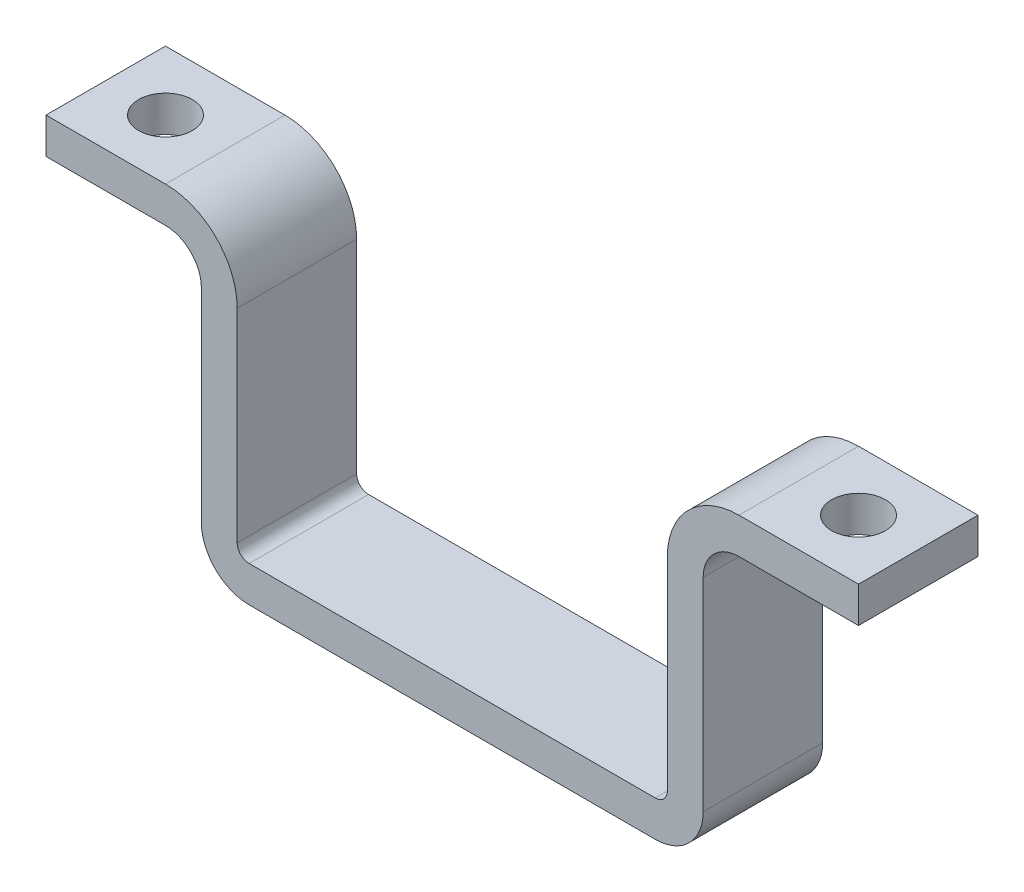
ISO-10303-21;
HEADER;
FILE_DESCRIPTION(('STEP AP214'),'2;1');
FILE_NAME('part.step','',(''),(''),'','','');
FILE_SCHEMA(('AUTOMOTIVE_DESIGN { 1 0 10303 214 1 1 1 1 }'));
ENDSEC;
DATA;
#1=APPLICATION_CONTEXT('core data for automotive mechanical design processes');
#2=APPLICATION_PROTOCOL_DEFINITION('international standard','automotive_design',2000,#1);
#3=PRODUCT_CONTEXT('',#1,'mechanical');
#4=PRODUCT('Part','Part','',(#3));
#5=PRODUCT_RELATED_PRODUCT_CATEGORY('part','',(#4));
#6=PRODUCT_DEFINITION_FORMATION('','',#4);
#7=PRODUCT_DEFINITION_CONTEXT('part definition',#1,'design');
#8=PRODUCT_DEFINITION('design','',#6,#7);
#9=PRODUCT_DEFINITION_SHAPE('','',#8);
#10=(LENGTH_UNIT() NAMED_UNIT(*) SI_UNIT(.MILLI.,.METRE.));
#11=(NAMED_UNIT(*) PLANE_ANGLE_UNIT() SI_UNIT($,.RADIAN.));
#12=(NAMED_UNIT(*) SI_UNIT($,.STERADIAN.) SOLID_ANGLE_UNIT());
#13=UNCERTAINTY_MEASURE_WITH_UNIT(LENGTH_MEASURE(1.E-05),#10,'distance_accuracy_value','');
#14=(GEOMETRIC_REPRESENTATION_CONTEXT(3) GLOBAL_UNCERTAINTY_ASSIGNED_CONTEXT((#13)) GLOBAL_UNIT_ASSIGNED_CONTEXT((#10,
#11,#12)) REPRESENTATION_CONTEXT('',''));
#15=CARTESIAN_POINT('',(0.,0.,0.));
#16=DIRECTION('',(0.,0.,1.));
#17=DIRECTION('',(1.,0.,0.));
#18=AXIS2_PLACEMENT_3D('',#15,#16,#17);
#19=CARTESIAN_POINT('',(-24.,18.,5.));
#20=DIRECTION('',(0.,0.,-1.));
#21=DIRECTION('',(-1.,0.,0.));
#22=AXIS2_PLACEMENT_3D('',#19,#20,#21);
#23=CYLINDRICAL_SURFACE('',#22,5.99999999999999);
#24=CARTESIAN_POINT('',(-24.,18.,-5.));
#25=DIRECTION('',(0.,0.,1.));
#26=DIRECTION('',(1.,0.,0.));
#27=AXIS2_PLACEMENT_3D('',#24,#25,#26);
#28=CIRCLE('',#27,5.99999999999999);
#29=CARTESIAN_POINT('',(-18.,18.,-5.));
#30=VERTEX_POINT('',#29);
#31=CARTESIAN_POINT('',(-24.,24.,-5.));
#32=VERTEX_POINT('',#31);
#33=EDGE_CURVE('E204',#30,#32,#28,.T.);
#34=ORIENTED_EDGE('',*,*,#33,.T.);
#35=DIRECTION('',(0.,0.,-1.));
#36=VECTOR('',#35,1.);
#37=CARTESIAN_POINT('',(-24.,24.,5.));
#38=LINE('',#37,#36);
#39=CARTESIAN_POINT('',(-24.,24.,5.));
#40=VERTEX_POINT('',#39);
#41=EDGE_CURVE('E11',#40,#32,#38,.T.);
#42=ORIENTED_EDGE('',*,*,#41,.F.);
#43=CARTESIAN_POINT('',(-24.,18.,5.));
#44=DIRECTION('',(0.,0.,1.));
#45=DIRECTION('',(1.,0.,0.));
#46=AXIS2_PLACEMENT_3D('',#43,#44,#45);
#47=CIRCLE('',#46,5.99999999999999);
#48=CARTESIAN_POINT('',(-18.,18.,5.));
#49=VERTEX_POINT('',#48);
#50=EDGE_CURVE('E253',#49,#40,#47,.T.);
#51=ORIENTED_EDGE('',*,*,#50,.F.);
#52=DIRECTION('',(0.,0.,-1.));
#53=VECTOR('',#52,1.);
#54=CARTESIAN_POINT('',(-18.,18.,5.));
#55=LINE('',#54,#53);
#56=EDGE_CURVE('E203',#49,#30,#55,.T.);
#57=ORIENTED_EDGE('',*,*,#56,.T.);
#58=EDGE_LOOP('',(#34,#42,#51,#57));
#59=FACE_BOUND('',#58,.T.);
#60=ADVANCED_FACE('F33',(#59),#23,.T.);
#61=CARTESIAN_POINT('',(-24.,24.,5.));
#62=DIRECTION('',(0.,-1.,0.));
#63=DIRECTION('',(1.,0.,0.));
#64=AXIS2_PLACEMENT_3D('',#61,#62,#63);
#65=PLANE('',#64);
#66=CARTESIAN_POINT('',(-29.,24.,0.));
#67=DIRECTION('',(0.,1.,0.));
#68=DIRECTION('',(-1.,0.,0.));
#69=AXIS2_PLACEMENT_3D('',#66,#67,#68);
#70=CIRCLE('',#69,2.25);
#71=CARTESIAN_POINT('',(-31.25,24.,0.));
#72=VERTEX_POINT('',#71);
#73=EDGE_CURVE('E509',#72,#72,#70,.T.);
#74=ORIENTED_EDGE('',*,*,#73,.F.);
#75=EDGE_LOOP('',(#74));
#76=FACE_BOUND('',#75,.T.);
#77=DIRECTION('',(-1.,0.,0.));
#78=VECTOR('',#77,1.);
#79=CARTESIAN_POINT('',(-24.,24.,-5.));
#80=LINE('',#79,#78);
#81=CARTESIAN_POINT('',(-34.,24.,-5.));
#82=VERTEX_POINT('',#81);
#83=EDGE_CURVE('E207',#32,#82,#80,.T.);
#84=ORIENTED_EDGE('',*,*,#83,.T.);
#85=DIRECTION('',(0.,0.,-1.));
#86=VECTOR('',#85,1.);
#87=CARTESIAN_POINT('',(-34.,24.,5.));
#88=LINE('',#87,#86);
#89=CARTESIAN_POINT('',(-34.,24.,5.));
#90=VERTEX_POINT('',#89);
#91=EDGE_CURVE('E42',#90,#82,#88,.T.);
#92=ORIENTED_EDGE('',*,*,#91,.F.);
#93=DIRECTION('',(-1.,0.,0.));
#94=VECTOR('',#93,1.);
#95=CARTESIAN_POINT('',(-24.,24.,5.));
#96=LINE('',#95,#94);
#97=EDGE_CURVE('E128',#40,#90,#96,.T.);
#98=ORIENTED_EDGE('',*,*,#97,.F.);
#99=ORIENTED_EDGE('',*,*,#41,.T.);
#100=EDGE_LOOP('',(#84,#92,#98,#99));
#101=FACE_BOUND('',#100,.T.);
#102=ADVANCED_FACE('F362',(#76,#101),#65,.F.);
#103=CARTESIAN_POINT('',(-34.,24.,5.));
#104=DIRECTION('',(1.,0.,0.));
#105=DIRECTION('',(0.,0.,-1.));
#106=AXIS2_PLACEMENT_3D('',#103,#104,#105);
#107=PLANE('',#106);
#108=DIRECTION('',(0.,-1.,0.));
#109=VECTOR('',#108,1.);
#110=CARTESIAN_POINT('',(-34.,24.,-5.));
#111=LINE('',#110,#109);
#112=CARTESIAN_POINT('',(-34.,21.,-5.));
#113=VERTEX_POINT('',#112);
#114=EDGE_CURVE('E209',#82,#113,#111,.T.);
#115=ORIENTED_EDGE('',*,*,#114,.T.);
#116=DIRECTION('',(0.,0.,-1.));
#117=VECTOR('',#116,1.);
#118=CARTESIAN_POINT('',(-34.,21.,5.));
#119=LINE('',#118,#117);
#120=CARTESIAN_POINT('',(-34.,21.,5.));
#121=VERTEX_POINT('',#120);
#122=EDGE_CURVE('E287',#121,#113,#119,.T.);
#123=ORIENTED_EDGE('',*,*,#122,.F.);
#124=DIRECTION('',(0.,-1.,0.));
#125=VECTOR('',#124,1.);
#126=CARTESIAN_POINT('',(-34.,24.,5.));
#127=LINE('',#126,#125);
#128=EDGE_CURVE('E295',#90,#121,#127,.T.);
#129=ORIENTED_EDGE('',*,*,#128,.F.);
#130=ORIENTED_EDGE('',*,*,#91,.T.);
#131=EDGE_LOOP('',(#115,#123,#129,#130));
#132=FACE_BOUND('',#131,.T.);
#133=ADVANCED_FACE('F293',(#132),#107,.F.);
#134=CARTESIAN_POINT('',(-24.,21.,5.));
#135=DIRECTION('',(0.,-1.,0.));
#136=DIRECTION('',(0.,0.,-1.));
#137=AXIS2_PLACEMENT_3D('',#134,#135,#136);
#138=PLANE('',#137);
#139=CARTESIAN_POINT('',(-29.,21.,0.));
#140=DIRECTION('',(0.,-1.,0.));
#141=DIRECTION('',(0.,0.,-1.));
#142=AXIS2_PLACEMENT_3D('',#139,#140,#141);
#143=CIRCLE('',#142,2.25);
#144=CARTESIAN_POINT('',(-29.,21.,-2.25));
#145=VERTEX_POINT('',#144);
#146=EDGE_CURVE('E36',#145,#145,#143,.T.);
#147=ORIENTED_EDGE('',*,*,#146,.F.);
#148=EDGE_LOOP('',(#147));
#149=FACE_BOUND('',#148,.T.);
#150=DIRECTION('',(-1.,0.,0.));
#151=VECTOR('',#150,1.);
#152=CARTESIAN_POINT('',(-24.,21.,-5.));
#153=LINE('',#152,#151);
#154=CARTESIAN_POINT('',(-24.,21.,-5.));
#155=VERTEX_POINT('',#154);
#156=EDGE_CURVE('E212',#155,#113,#153,.T.);
#157=ORIENTED_EDGE('',*,*,#156,.F.);
#158=DIRECTION('',(0.,0.,-1.));
#159=VECTOR('',#158,1.);
#160=CARTESIAN_POINT('',(-24.,21.,5.));
#161=LINE('',#160,#159);
#162=CARTESIAN_POINT('',(-24.,21.,5.));
#163=VERTEX_POINT('',#162);
#164=EDGE_CURVE('E285',#163,#155,#161,.T.);
#165=ORIENTED_EDGE('',*,*,#164,.F.);
#166=DIRECTION('',(-1.,0.,0.));
#167=VECTOR('',#166,1.);
#168=CARTESIAN_POINT('',(-24.,21.,5.));
#169=LINE('',#168,#167);
#170=EDGE_CURVE('E305',#163,#121,#169,.T.);
#171=ORIENTED_EDGE('',*,*,#170,.T.);
#172=ORIENTED_EDGE('',*,*,#122,.T.);
#173=EDGE_LOOP('',(#157,#165,#171,#172));
#174=FACE_BOUND('',#173,.T.);
#175=ADVANCED_FACE('F302',(#149,#174),#138,.T.);
#176=CARTESIAN_POINT('',(-24.,18.,5.));
#177=DIRECTION('',(0.,0.,-1.));
#178=DIRECTION('',(-1.,0.,0.));
#179=AXIS2_PLACEMENT_3D('',#176,#177,#178);
#180=CYLINDRICAL_SURFACE('',#179,3.);
#181=CARTESIAN_POINT('',(-24.,18.,-5.));
#182=DIRECTION('',(0.,0.,1.));
#183=DIRECTION('',(1.,0.,0.));
#184=AXIS2_PLACEMENT_3D('',#181,#182,#183);
#185=CIRCLE('',#184,3.);
#186=CARTESIAN_POINT('',(-21.,18.,-5.));
#187=VERTEX_POINT('',#186);
#188=EDGE_CURVE('E215',#187,#155,#185,.T.);
#189=ORIENTED_EDGE('',*,*,#188,.F.);
#190=DIRECTION('',(0.,0.,-1.));
#191=VECTOR('',#190,1.);
#192=CARTESIAN_POINT('',(-21.,18.,5.));
#193=LINE('',#192,#191);
#194=CARTESIAN_POINT('',(-21.,18.,5.));
#195=VERTEX_POINT('',#194);
#196=EDGE_CURVE('E283',#195,#187,#193,.T.);
#197=ORIENTED_EDGE('',*,*,#196,.F.);
#198=CARTESIAN_POINT('',(-24.,18.,5.));
#199=DIRECTION('',(0.,0.,1.));
#200=DIRECTION('',(1.,0.,0.));
#201=AXIS2_PLACEMENT_3D('',#198,#199,#200);
#202=CIRCLE('',#201,3.);
#203=EDGE_CURVE('E308',#195,#163,#202,.T.);
#204=ORIENTED_EDGE('',*,*,#203,.T.);
#205=ORIENTED_EDGE('',*,*,#164,.T.);
#206=EDGE_LOOP('',(#189,#197,#204,#205));
#207=FACE_BOUND('',#206,.T.);
#208=ADVANCED_FACE('F375',(#207),#180,.F.);
#209=CARTESIAN_POINT('',(-21.,1.,5.));
#210=DIRECTION('',(-1.,0.,0.));
#211=DIRECTION('',(0.,0.,1.));
#212=AXIS2_PLACEMENT_3D('',#209,#210,#211);
#213=PLANE('',#212);
#214=DIRECTION('',(0.,1.,0.));
#215=VECTOR('',#214,1.);
#216=CARTESIAN_POINT('',(-21.,1.,-5.));
#217=LINE('',#216,#215);
#218=CARTESIAN_POINT('',(-21.,1.,-5.));
#219=VERTEX_POINT('',#218);
#220=EDGE_CURVE('E218',#219,#187,#217,.T.);
#221=ORIENTED_EDGE('',*,*,#220,.F.);
#222=DIRECTION('',(0.,0.,-1.));
#223=VECTOR('',#222,1.);
#224=CARTESIAN_POINT('',(-21.,1.,5.));
#225=LINE('',#224,#223);
#226=CARTESIAN_POINT('',(-21.,1.,5.));
#227=VERTEX_POINT('',#226);
#228=EDGE_CURVE('E281',#227,#219,#225,.T.);
#229=ORIENTED_EDGE('',*,*,#228,.F.);
#230=DIRECTION('',(0.,1.,0.));
#231=VECTOR('',#230,1.);
#232=CARTESIAN_POINT('',(-21.,1.,5.));
#233=LINE('',#232,#231);
#234=EDGE_CURVE('E310',#227,#195,#233,.T.);
#235=ORIENTED_EDGE('',*,*,#234,.T.);
#236=ORIENTED_EDGE('',*,*,#196,.T.);
#237=EDGE_LOOP('',(#221,#229,#235,#236));
#238=FACE_BOUND('',#237,.T.);
#239=ADVANCED_FACE('F379',(#238),#213,.T.);
#240=CARTESIAN_POINT('',(-17.,1.,5.));
#241=DIRECTION('',(0.,0.,-1.));
#242=DIRECTION('',(-1.,0.,0.));
#243=AXIS2_PLACEMENT_3D('',#240,#241,#242);
#244=CYLINDRICAL_SURFACE('',#243,4.);
#245=CARTESIAN_POINT('',(-17.,1.,-5.));
#246=DIRECTION('',(0.,0.,-1.));
#247=DIRECTION('',(-1.,0.,0.));
#248=AXIS2_PLACEMENT_3D('',#245,#246,#247);
#249=CIRCLE('',#248,4.);
#250=CARTESIAN_POINT('',(-17.,-3.,-5.));
#251=VERTEX_POINT('',#250);
#252=EDGE_CURVE('E221',#251,#219,#249,.T.);
#253=ORIENTED_EDGE('',*,*,#252,.F.);
#254=DIRECTION('',(0.,0.,-1.));
#255=VECTOR('',#254,1.);
#256=CARTESIAN_POINT('',(-17.,-3.,5.));
#257=LINE('',#256,#255);
#258=CARTESIAN_POINT('',(-17.,-3.,5.));
#259=VERTEX_POINT('',#258);
#260=EDGE_CURVE('E279',#259,#251,#257,.T.);
#261=ORIENTED_EDGE('',*,*,#260,.F.);
#262=CARTESIAN_POINT('',(-17.,1.,5.));
#263=DIRECTION('',(0.,0.,-1.));
#264=DIRECTION('',(-1.,0.,0.));
#265=AXIS2_PLACEMENT_3D('',#262,#263,#264);
#266=CIRCLE('',#265,4.);
#267=EDGE_CURVE('E317',#259,#227,#266,.T.);
#268=ORIENTED_EDGE('',*,*,#267,.T.);
#269=ORIENTED_EDGE('',*,*,#228,.T.);
#270=EDGE_LOOP('',(#253,#261,#268,#269));
#271=FACE_BOUND('',#270,.T.);
#272=ADVANCED_FACE('F383',(#271),#244,.T.);
#273=CARTESIAN_POINT('',(-17.,-3.,5.));
#274=DIRECTION('',(0.,1.,0.));
#275=DIRECTION('',(-1.,0.,0.));
#276=AXIS2_PLACEMENT_3D('',#273,#274,#275);
#277=PLANE('',#276);
#278=DIRECTION('',(1.,0.,0.));
#279=VECTOR('',#278,1.);
#280=CARTESIAN_POINT('',(-17.,-3.,-5.));
#281=LINE('',#280,#279);
#282=CARTESIAN_POINT('',(17.,-2.99999999999999,-5.));
#283=VERTEX_POINT('',#282);
#284=EDGE_CURVE('E224',#251,#283,#281,.T.);
#285=ORIENTED_EDGE('',*,*,#284,.T.);
#286=DIRECTION('',(0.,0.,-1.));
#287=VECTOR('',#286,1.);
#288=CARTESIAN_POINT('',(17.,-2.99999999999999,5.));
#289=LINE('',#288,#287);
#290=CARTESIAN_POINT('',(17.,-2.99999999999999,5.));
#291=VERTEX_POINT('',#290);
#292=EDGE_CURVE('E276',#291,#283,#289,.T.);
#293=ORIENTED_EDGE('',*,*,#292,.F.);
#294=DIRECTION('',(1.,0.,0.));
#295=VECTOR('',#294,1.);
#296=CARTESIAN_POINT('',(-17.,-3.,5.));
#297=LINE('',#296,#295);
#298=EDGE_CURVE('E320',#259,#291,#297,.T.);
#299=ORIENTED_EDGE('',*,*,#298,.F.);
#300=ORIENTED_EDGE('',*,*,#260,.T.);
#301=EDGE_LOOP('',(#285,#293,#299,#300));
#302=FACE_BOUND('',#301,.T.);
#303=ADVANCED_FACE('F387',(#302),#277,.F.);
#304=CARTESIAN_POINT('',(17.,1.00000000000001,5.));
#305=DIRECTION('',(0.,0.,-1.));
#306=DIRECTION('',(-1.,0.,0.));
#307=AXIS2_PLACEMENT_3D('',#304,#305,#306);
#308=CYLINDRICAL_SURFACE('',#307,4.);
#309=CARTESIAN_POINT('',(17.,1.00000000000001,-5.));
#310=DIRECTION('',(0.,0.,1.));
#311=DIRECTION('',(1.,0.,0.));
#312=AXIS2_PLACEMENT_3D('',#309,#310,#311);
#313=CIRCLE('',#312,4.);
#314=CARTESIAN_POINT('',(21.,1.00000000000001,-5.));
#315=VERTEX_POINT('',#314);
#316=EDGE_CURVE('E226',#283,#315,#313,.T.);
#317=ORIENTED_EDGE('',*,*,#316,.T.);
#318=DIRECTION('',(0.,0.,-1.));
#319=VECTOR('',#318,1.);
#320=CARTESIAN_POINT('',(21.,1.00000000000001,5.));
#321=LINE('',#320,#319);
#322=CARTESIAN_POINT('',(21.,1.00000000000001,5.));
#323=VERTEX_POINT('',#322);
#324=EDGE_CURVE('E273',#323,#315,#321,.T.);
#325=ORIENTED_EDGE('',*,*,#324,.F.);
#326=CARTESIAN_POINT('',(17.,1.00000000000001,5.));
#327=DIRECTION('',(0.,0.,1.));
#328=DIRECTION('',(1.,0.,0.));
#329=AXIS2_PLACEMENT_3D('',#326,#327,#328);
#330=CIRCLE('',#329,4.);
#331=EDGE_CURVE('E322',#291,#323,#330,.T.);
#332=ORIENTED_EDGE('',*,*,#331,.F.);
#333=ORIENTED_EDGE('',*,*,#292,.T.);
#334=EDGE_LOOP('',(#317,#325,#332,#333));
#335=FACE_BOUND('',#334,.T.);
#336=ADVANCED_FACE('F391',(#335),#308,.T.);
#337=CARTESIAN_POINT('',(21.,1.00000000000001,5.));
#338=DIRECTION('',(-1.,0.,0.));
#339=DIRECTION('',(0.,0.,1.));
#340=AXIS2_PLACEMENT_3D('',#337,#338,#339);
#341=PLANE('',#340);
#342=DIRECTION('',(0.,1.,0.));
#343=VECTOR('',#342,1.);
#344=CARTESIAN_POINT('',(21.,1.00000000000001,-5.));
#345=LINE('',#344,#343);
#346=CARTESIAN_POINT('',(21.,18.,-5.));
#347=VERTEX_POINT('',#346);
#348=EDGE_CURVE('E228',#315,#347,#345,.T.);
#349=ORIENTED_EDGE('',*,*,#348,.T.);
#350=DIRECTION('',(0.,0.,-1.));
#351=VECTOR('',#350,1.);
#352=CARTESIAN_POINT('',(21.,18.,5.));
#353=LINE('',#352,#351);
#354=CARTESIAN_POINT('',(21.,18.,5.));
#355=VERTEX_POINT('',#354);
#356=EDGE_CURVE('E270',#355,#347,#353,.T.);
#357=ORIENTED_EDGE('',*,*,#356,.F.);
#358=DIRECTION('',(0.,1.,0.));
#359=VECTOR('',#358,1.);
#360=CARTESIAN_POINT('',(21.,1.00000000000001,5.));
#361=LINE('',#360,#359);
#362=EDGE_CURVE('E324',#323,#355,#361,.T.);
#363=ORIENTED_EDGE('',*,*,#362,.F.);
#364=ORIENTED_EDGE('',*,*,#324,.T.);
#365=EDGE_LOOP('',(#349,#357,#363,#364));
#366=FACE_BOUND('',#365,.T.);
#367=ADVANCED_FACE('F395',(#366),#341,.F.);
#368=CARTESIAN_POINT('',(24.,18.,5.));
#369=DIRECTION('',(0.,0.,-1.));
#370=DIRECTION('',(-1.,0.,0.));
#371=AXIS2_PLACEMENT_3D('',#368,#369,#370);
#372=CYLINDRICAL_SURFACE('',#371,3.);
#373=CARTESIAN_POINT('',(24.,18.,-5.));
#374=DIRECTION('',(0.,0.,-1.));
#375=DIRECTION('',(-1.,0.,0.));
#376=AXIS2_PLACEMENT_3D('',#373,#374,#375);
#377=CIRCLE('',#376,3.);
#378=CARTESIAN_POINT('',(24.,21.,-5.));
#379=VERTEX_POINT('',#378);
#380=EDGE_CURVE('E230',#347,#379,#377,.T.);
#381=ORIENTED_EDGE('',*,*,#380,.T.);
#382=DIRECTION('',(0.,0.,-1.));
#383=VECTOR('',#382,1.);
#384=CARTESIAN_POINT('',(24.,21.,5.));
#385=LINE('',#384,#383);
#386=CARTESIAN_POINT('',(24.,21.,5.));
#387=VERTEX_POINT('',#386);
#388=EDGE_CURVE('E267',#387,#379,#385,.T.);
#389=ORIENTED_EDGE('',*,*,#388,.F.);
#390=CARTESIAN_POINT('',(24.,18.,5.));
#391=DIRECTION('',(0.,0.,-1.));
#392=DIRECTION('',(-1.,0.,0.));
#393=AXIS2_PLACEMENT_3D('',#390,#391,#392);
#394=CIRCLE('',#393,3.);
#395=EDGE_CURVE('E326',#355,#387,#394,.T.);
#396=ORIENTED_EDGE('',*,*,#395,.F.);
#397=ORIENTED_EDGE('',*,*,#356,.T.);
#398=EDGE_LOOP('',(#381,#389,#396,#397));
#399=FACE_BOUND('',#398,.T.);
#400=ADVANCED_FACE('F399',(#399),#372,.F.);
#401=CARTESIAN_POINT('',(24.,21.,5.));
#402=DIRECTION('',(0.,1.,0.));
#403=DIRECTION('',(0.,0.,1.));
#404=AXIS2_PLACEMENT_3D('',#401,#402,#403);
#405=PLANE('',#404);
#406=CARTESIAN_POINT('',(29.,21.,0.));
#407=DIRECTION('',(0.,1.,0.));
#408=DIRECTION('',(0.,0.,1.));
#409=AXIS2_PLACEMENT_3D('',#406,#407,#408);
#410=CIRCLE('',#409,2.25);
#411=CARTESIAN_POINT('',(29.,21.,2.25));
#412=VERTEX_POINT('',#411);
#413=EDGE_CURVE('E508',#412,#412,#410,.F.);
#414=ORIENTED_EDGE('',*,*,#413,.F.);
#415=EDGE_LOOP('',(#414));
#416=FACE_BOUND('',#415,.T.);
#417=DIRECTION('',(1.,0.,0.));
#418=VECTOR('',#417,1.);
#419=CARTESIAN_POINT('',(24.,21.,-5.));
#420=LINE('',#419,#418);
#421=CARTESIAN_POINT('',(34.,21.,-5.));
#422=VERTEX_POINT('',#421);
#423=EDGE_CURVE('E232',#379,#422,#420,.T.);
#424=ORIENTED_EDGE('',*,*,#423,.T.);
#425=DIRECTION('',(0.,0.,-1.));
#426=VECTOR('',#425,1.);
#427=CARTESIAN_POINT('',(34.,21.,5.));
#428=LINE('',#427,#426);
#429=CARTESIAN_POINT('',(34.,21.,5.));
#430=VERTEX_POINT('',#429);
#431=EDGE_CURVE('E265',#430,#422,#428,.T.);
#432=ORIENTED_EDGE('',*,*,#431,.F.);
#433=DIRECTION('',(1.,0.,0.));
#434=VECTOR('',#433,1.);
#435=CARTESIAN_POINT('',(24.,21.,5.));
#436=LINE('',#435,#434);
#437=EDGE_CURVE('E328',#387,#430,#436,.T.);
#438=ORIENTED_EDGE('',*,*,#437,.F.);
#439=ORIENTED_EDGE('',*,*,#388,.T.);
#440=EDGE_LOOP('',(#424,#432,#438,#439));
#441=FACE_BOUND('',#440,.T.);
#442=ADVANCED_FACE('F403',(#416,#441),#405,.F.);
#443=CARTESIAN_POINT('',(34.,24.,5.));
#444=DIRECTION('',(1.,0.,0.));
#445=DIRECTION('',(0.,0.,-1.));
#446=AXIS2_PLACEMENT_3D('',#443,#444,#445);
#447=PLANE('',#446);
#448=DIRECTION('',(0.,-1.,0.));
#449=VECTOR('',#448,1.);
#450=CARTESIAN_POINT('',(34.,24.,-5.));
#451=LINE('',#450,#449);
#452=CARTESIAN_POINT('',(34.,24.,-5.));
#453=VERTEX_POINT('',#452);
#454=EDGE_CURVE('E235',#453,#422,#451,.T.);
#455=ORIENTED_EDGE('',*,*,#454,.F.);
#456=DIRECTION('',(0.,0.,-1.));
#457=VECTOR('',#456,1.);
#458=CARTESIAN_POINT('',(34.,24.,5.));
#459=LINE('',#458,#457);
#460=CARTESIAN_POINT('',(34.,24.,5.));
#461=VERTEX_POINT('',#460);
#462=EDGE_CURVE('E263',#461,#453,#459,.T.);
#463=ORIENTED_EDGE('',*,*,#462,.F.);
#464=DIRECTION('',(0.,-1.,0.));
#465=VECTOR('',#464,1.);
#466=CARTESIAN_POINT('',(34.,24.,5.));
#467=LINE('',#466,#465);
#468=EDGE_CURVE('E330',#461,#430,#467,.T.);
#469=ORIENTED_EDGE('',*,*,#468,.T.);
#470=ORIENTED_EDGE('',*,*,#431,.T.);
#471=EDGE_LOOP('',(#455,#463,#469,#470));
#472=FACE_BOUND('',#471,.T.);
#473=ADVANCED_FACE('F407',(#472),#447,.T.);
#474=CARTESIAN_POINT('',(24.,24.,5.));
#475=DIRECTION('',(0.,1.,0.));
#476=DIRECTION('',(-1.,0.,0.));
#477=AXIS2_PLACEMENT_3D('',#474,#475,#476);
#478=PLANE('',#477);
#479=CARTESIAN_POINT('',(29.,24.,0.));
#480=DIRECTION('',(0.,-1.,0.));
#481=DIRECTION('',(1.,0.,0.));
#482=AXIS2_PLACEMENT_3D('',#479,#480,#481);
#483=CIRCLE('',#482,2.25);
#484=CARTESIAN_POINT('',(31.25,24.,0.));
#485=VERTEX_POINT('',#484);
#486=EDGE_CURVE('E505',#485,#485,#483,.T.);
#487=ORIENTED_EDGE('',*,*,#486,.T.);
#488=EDGE_LOOP('',(#487));
#489=FACE_BOUND('',#488,.T.);
#490=DIRECTION('',(1.,0.,0.));
#491=VECTOR('',#490,1.);
#492=CARTESIAN_POINT('',(24.,24.,-5.));
#493=LINE('',#492,#491);
#494=CARTESIAN_POINT('',(24.,24.,-5.));
#495=VERTEX_POINT('',#494);
#496=EDGE_CURVE('E238',#495,#453,#493,.T.);
#497=ORIENTED_EDGE('',*,*,#496,.F.);
#498=DIRECTION('',(0.,0.,-1.));
#499=VECTOR('',#498,1.);
#500=CARTESIAN_POINT('',(24.,24.,5.));
#501=LINE('',#500,#499);
#502=CARTESIAN_POINT('',(24.,24.,5.));
#503=VERTEX_POINT('',#502);
#504=EDGE_CURVE('E261',#503,#495,#501,.T.);
#505=ORIENTED_EDGE('',*,*,#504,.F.);
#506=DIRECTION('',(1.,0.,0.));
#507=VECTOR('',#506,1.);
#508=CARTESIAN_POINT('',(24.,24.,5.));
#509=LINE('',#508,#507);
#510=EDGE_CURVE('E333',#503,#461,#509,.T.);
#511=ORIENTED_EDGE('',*,*,#510,.T.);
#512=ORIENTED_EDGE('',*,*,#462,.T.);
#513=EDGE_LOOP('',(#497,#505,#511,#512));
#514=FACE_BOUND('',#513,.T.);
#515=ADVANCED_FACE('F411',(#489,#514),#478,.T.);
#516=CARTESIAN_POINT('',(24.,18.,5.));
#517=DIRECTION('',(0.,0.,-1.));
#518=DIRECTION('',(-1.,0.,0.));
#519=AXIS2_PLACEMENT_3D('',#516,#517,#518);
#520=CYLINDRICAL_SURFACE('',#519,5.99999999999999);
#521=CARTESIAN_POINT('',(24.,18.,-5.));
#522=DIRECTION('',(0.,0.,-1.));
#523=DIRECTION('',(-1.,0.,0.));
#524=AXIS2_PLACEMENT_3D('',#521,#522,#523);
#525=CIRCLE('',#524,5.99999999999999);
#526=CARTESIAN_POINT('',(18.,18.,-5.));
#527=VERTEX_POINT('',#526);
#528=EDGE_CURVE('E241',#527,#495,#525,.T.);
#529=ORIENTED_EDGE('',*,*,#528,.F.);
#530=DIRECTION('',(0.,0.,-1.));
#531=VECTOR('',#530,1.);
#532=CARTESIAN_POINT('',(18.,18.,5.));
#533=LINE('',#532,#531);
#534=CARTESIAN_POINT('',(18.,18.,5.));
#535=VERTEX_POINT('',#534);
#536=EDGE_CURVE('E259',#535,#527,#533,.T.);
#537=ORIENTED_EDGE('',*,*,#536,.F.);
#538=CARTESIAN_POINT('',(24.,18.,5.));
#539=DIRECTION('',(0.,0.,-1.));
#540=DIRECTION('',(-1.,0.,0.));
#541=AXIS2_PLACEMENT_3D('',#538,#539,#540);
#542=CIRCLE('',#541,5.99999999999999);
#543=EDGE_CURVE('E336',#535,#503,#542,.T.);
#544=ORIENTED_EDGE('',*,*,#543,.T.);
#545=ORIENTED_EDGE('',*,*,#504,.T.);
#546=EDGE_LOOP('',(#529,#537,#544,#545));
#547=FACE_BOUND('',#546,.T.);
#548=ADVANCED_FACE('F415',(#547),#520,.T.);
#549=CARTESIAN_POINT('',(18.,1.00000000000001,5.));
#550=DIRECTION('',(-1.,0.,0.));
#551=DIRECTION('',(0.,-1.,0.));
#552=AXIS2_PLACEMENT_3D('',#549,#550,#551);
#553=PLANE('',#552);
#554=DIRECTION('',(0.,1.,0.));
#555=VECTOR('',#554,1.);
#556=CARTESIAN_POINT('',(18.,1.00000000000001,-5.));
#557=LINE('',#556,#555);
#558=CARTESIAN_POINT('',(18.,1.00000000000001,-5.));
#559=VERTEX_POINT('',#558);
#560=EDGE_CURVE('E244',#559,#527,#557,.T.);
#561=ORIENTED_EDGE('',*,*,#560,.F.);
#562=DIRECTION('',(0.,0.,-1.));
#563=VECTOR('',#562,1.);
#564=CARTESIAN_POINT('',(18.,1.00000000000001,5.));
#565=LINE('',#564,#563);
#566=CARTESIAN_POINT('',(18.,1.00000000000001,5.));
#567=VERTEX_POINT('',#566);
#568=EDGE_CURVE('E257',#567,#559,#565,.T.);
#569=ORIENTED_EDGE('',*,*,#568,.F.);
#570=DIRECTION('',(0.,1.,0.));
#571=VECTOR('',#570,1.);
#572=CARTESIAN_POINT('',(18.,1.00000000000001,5.));
#573=LINE('',#572,#571);
#574=EDGE_CURVE('E198',#567,#535,#573,.T.);
#575=ORIENTED_EDGE('',*,*,#574,.T.);
#576=ORIENTED_EDGE('',*,*,#536,.T.);
#577=EDGE_LOOP('',(#561,#569,#575,#576));
#578=FACE_BOUND('',#577,.T.);
#579=ADVANCED_FACE('F341',(#578),#553,.T.);
#580=CARTESIAN_POINT('',(17.,1.00000000000001,5.));
#581=DIRECTION('',(0.,0.,-1.));
#582=DIRECTION('',(-1.,0.,0.));
#583=AXIS2_PLACEMENT_3D('',#580,#581,#582);
#584=CYLINDRICAL_SURFACE('',#583,0.999999999999999);
#585=CARTESIAN_POINT('',(17.,1.00000000000001,-5.));
#586=DIRECTION('',(0.,0.,1.));
#587=DIRECTION('',(1.,0.,0.));
#588=AXIS2_PLACEMENT_3D('',#585,#586,#587);
#589=CIRCLE('',#588,0.999999999999999);
#590=CARTESIAN_POINT('',(17.,0.,-5.));
#591=VERTEX_POINT('',#590);
#592=EDGE_CURVE('E247',#591,#559,#589,.T.);
#593=ORIENTED_EDGE('',*,*,#592,.F.);
#594=DIRECTION('',(0.,0.,-1.));
#595=VECTOR('',#594,1.);
#596=CARTESIAN_POINT('',(17.,0.,5.));
#597=LINE('',#596,#595);
#598=CARTESIAN_POINT('',(17.,0.,5.));
#599=VERTEX_POINT('',#598);
#600=EDGE_CURVE('E186',#599,#591,#597,.T.);
#601=ORIENTED_EDGE('',*,*,#600,.F.);
#602=CARTESIAN_POINT('',(17.,1.00000000000001,5.));
#603=DIRECTION('',(0.,0.,1.));
#604=DIRECTION('',(1.,0.,0.));
#605=AXIS2_PLACEMENT_3D('',#602,#603,#604);
#606=CIRCLE('',#605,0.999999999999999);
#607=EDGE_CURVE('E196',#599,#567,#606,.T.);
#608=ORIENTED_EDGE('',*,*,#607,.T.);
#609=ORIENTED_EDGE('',*,*,#568,.T.);
#610=EDGE_LOOP('',(#593,#601,#608,#609));
#611=FACE_BOUND('',#610,.T.);
#612=ADVANCED_FACE('F347',(#611),#584,.F.);
#613=CARTESIAN_POINT('',(-17.,0.,5.));
#614=DIRECTION('',(0.,1.,0.));
#615=DIRECTION('',(-1.,0.,0.));
#616=AXIS2_PLACEMENT_3D('',#613,#614,#615);
#617=PLANE('',#616);
#618=DIRECTION('',(1.,0.,0.));
#619=VECTOR('',#618,1.);
#620=CARTESIAN_POINT('',(-17.,0.,-5.));
#621=LINE('',#620,#619);
#622=CARTESIAN_POINT('',(-17.,0.,-5.));
#623=VERTEX_POINT('',#622);
#624=EDGE_CURVE('E185',#623,#591,#621,.T.);
#625=ORIENTED_EDGE('',*,*,#624,.F.);
#626=DIRECTION('',(0.,0.,-1.));
#627=VECTOR('',#626,1.);
#628=CARTESIAN_POINT('',(-17.,0.,5.));
#629=LINE('',#628,#627);
#630=CARTESIAN_POINT('',(-17.,0.,5.));
#631=VERTEX_POINT('',#630);
#632=EDGE_CURVE('E179',#631,#623,#629,.T.);
#633=ORIENTED_EDGE('',*,*,#632,.F.);
#634=DIRECTION('',(1.,0.,0.));
#635=VECTOR('',#634,1.);
#636=CARTESIAN_POINT('',(-17.,0.,5.));
#637=LINE('',#636,#635);
#638=EDGE_CURVE('E183',#631,#599,#637,.T.);
#639=ORIENTED_EDGE('',*,*,#638,.T.);
#640=ORIENTED_EDGE('',*,*,#600,.T.);
#641=EDGE_LOOP('',(#625,#633,#639,#640));
#642=FACE_BOUND('',#641,.T.);
#643=ADVANCED_FACE('F181',(#642),#617,.T.);
#644=CARTESIAN_POINT('',(-17.,1.,5.));
#645=DIRECTION('',(0.,0.,-1.));
#646=DIRECTION('',(-1.,0.,0.));
#647=AXIS2_PLACEMENT_3D('',#644,#645,#646);
#648=CYLINDRICAL_SURFACE('',#647,0.999999999999999);
#649=CARTESIAN_POINT('',(-17.,1.,-5.));
#650=DIRECTION('',(0.,0.,-1.));
#651=DIRECTION('',(-1.,0.,0.));
#652=AXIS2_PLACEMENT_3D('',#649,#650,#651);
#653=CIRCLE('',#652,0.999999999999999);
#654=CARTESIAN_POINT('',(-18.,1.,-5.));
#655=VERTEX_POINT('',#654);
#656=EDGE_CURVE('E114',#623,#655,#653,.T.);
#657=ORIENTED_EDGE('',*,*,#656,.T.);
#658=DIRECTION('',(0.,0.,-1.));
#659=VECTOR('',#658,1.);
#660=CARTESIAN_POINT('',(-18.,1.,5.));
#661=LINE('',#660,#659);
#662=CARTESIAN_POINT('',(-18.,1.,5.));
#663=VERTEX_POINT('',#662);
#664=EDGE_CURVE('E187',#663,#655,#661,.T.);
#665=ORIENTED_EDGE('',*,*,#664,.F.);
#666=CARTESIAN_POINT('',(-17.,1.,5.));
#667=DIRECTION('',(0.,0.,-1.));
#668=DIRECTION('',(-1.,0.,0.));
#669=AXIS2_PLACEMENT_3D('',#666,#667,#668);
#670=CIRCLE('',#669,0.999999999999999);
#671=EDGE_CURVE('E189',#631,#663,#670,.T.);
#672=ORIENTED_EDGE('',*,*,#671,.F.);
#673=ORIENTED_EDGE('',*,*,#632,.T.);
#674=EDGE_LOOP('',(#657,#665,#672,#673));
#675=FACE_BOUND('',#674,.T.);
#676=ADVANCED_FACE('F190',(#675),#648,.F.);
#677=CARTESIAN_POINT('',(-18.,1.,5.));
#678=DIRECTION('',(-1.,0.,0.));
#679=DIRECTION('',(0.,-1.,0.));
#680=AXIS2_PLACEMENT_3D('',#677,#678,#679);
#681=PLANE('',#680);
#682=DIRECTION('',(0.,1.,0.));
#683=VECTOR('',#682,1.);
#684=CARTESIAN_POINT('',(-18.,1.,-5.));
#685=LINE('',#684,#683);
#686=EDGE_CURVE('E120',#655,#30,#685,.T.);
#687=ORIENTED_EDGE('',*,*,#686,.T.);
#688=ORIENTED_EDGE('',*,*,#56,.F.);
#689=DIRECTION('',(0.,1.,0.));
#690=VECTOR('',#689,1.);
#691=CARTESIAN_POINT('',(-18.,1.,5.));
#692=LINE('',#691,#690);
#693=EDGE_CURVE('E50',#663,#49,#692,.T.);
#694=ORIENTED_EDGE('',*,*,#693,.F.);
#695=ORIENTED_EDGE('',*,*,#664,.T.);
#696=EDGE_LOOP('',(#687,#688,#694,#695));
#697=FACE_BOUND('',#696,.T.);
#698=ADVANCED_FACE('F351',(#697),#681,.F.);
#699=CARTESIAN_POINT('',(-24.,18.,5.));
#700=DIRECTION('',(0.,0.,1.));
#701=DIRECTION('',(1.,0.,0.));
#702=AXIS2_PLACEMENT_3D('',#699,#700,#701);
#703=PLANE('',#702);
#704=ORIENTED_EDGE('',*,*,#50,.T.);
#705=ORIENTED_EDGE('',*,*,#97,.T.);
#706=ORIENTED_EDGE('',*,*,#128,.T.);
#707=ORIENTED_EDGE('',*,*,#170,.F.);
#708=ORIENTED_EDGE('',*,*,#203,.F.);
#709=ORIENTED_EDGE('',*,*,#234,.F.);
#710=ORIENTED_EDGE('',*,*,#267,.F.);
#711=ORIENTED_EDGE('',*,*,#298,.T.);
#712=ORIENTED_EDGE('',*,*,#331,.T.);
#713=ORIENTED_EDGE('',*,*,#362,.T.);
#714=ORIENTED_EDGE('',*,*,#395,.T.);
#715=ORIENTED_EDGE('',*,*,#437,.T.);
#716=ORIENTED_EDGE('',*,*,#468,.F.);
#717=ORIENTED_EDGE('',*,*,#510,.F.);
#718=ORIENTED_EDGE('',*,*,#543,.F.);
#719=ORIENTED_EDGE('',*,*,#574,.F.);
#720=ORIENTED_EDGE('',*,*,#607,.F.);
#721=ORIENTED_EDGE('',*,*,#638,.F.);
#722=ORIENTED_EDGE('',*,*,#671,.T.);
#723=ORIENTED_EDGE('',*,*,#693,.T.);
#724=EDGE_LOOP('',(#704,#705,#706,#707,#708,#709,#710,#711,#712,#713,#714,#715,#716,#717,#718,
#719,#720,#721,#722,#723));
#725=FACE_BOUND('',#724,.T.);
#726=ADVANCED_FACE('F193',(#725),#703,.T.);
#727=CARTESIAN_POINT('',(-24.,18.,-5.));
#728=DIRECTION('',(0.,0.,1.));
#729=DIRECTION('',(1.,0.,0.));
#730=AXIS2_PLACEMENT_3D('',#727,#728,#729);
#731=PLANE('',#730);
#732=ORIENTED_EDGE('',*,*,#33,.F.);
#733=ORIENTED_EDGE('',*,*,#686,.F.);
#734=ORIENTED_EDGE('',*,*,#656,.F.);
#735=ORIENTED_EDGE('',*,*,#624,.T.);
#736=ORIENTED_EDGE('',*,*,#592,.T.);
#737=ORIENTED_EDGE('',*,*,#560,.T.);
#738=ORIENTED_EDGE('',*,*,#528,.T.);
#739=ORIENTED_EDGE('',*,*,#496,.T.);
#740=ORIENTED_EDGE('',*,*,#454,.T.);
#741=ORIENTED_EDGE('',*,*,#423,.F.);
#742=ORIENTED_EDGE('',*,*,#380,.F.);
#743=ORIENTED_EDGE('',*,*,#348,.F.);
#744=ORIENTED_EDGE('',*,*,#316,.F.);
#745=ORIENTED_EDGE('',*,*,#284,.F.);
#746=ORIENTED_EDGE('',*,*,#252,.T.);
#747=ORIENTED_EDGE('',*,*,#220,.T.);
#748=ORIENTED_EDGE('',*,*,#188,.T.);
#749=ORIENTED_EDGE('',*,*,#156,.T.);
#750=ORIENTED_EDGE('',*,*,#114,.F.);
#751=ORIENTED_EDGE('',*,*,#83,.F.);
#752=EDGE_LOOP('',(#732,#733,#734,#735,#736,#737,#738,#739,#740,#741,#742,#743,#744,#745,#746,
#747,#748,#749,#750,#751));
#753=FACE_BOUND('',#752,.T.);
#754=ADVANCED_FACE('F298',(#753),#731,.F.);
#755=CARTESIAN_POINT('',(-29.,-3.,0.));
#756=DIRECTION('',(0.,1.,0.));
#757=DIRECTION('',(-1.,0.,0.));
#758=AXIS2_PLACEMENT_3D('',#755,#756,#757);
#759=CYLINDRICAL_SURFACE('',#758,2.25);
#760=ORIENTED_EDGE('',*,*,#146,.T.);
#761=EDGE_LOOP('',(#760));
#762=FACE_BOUND('',#761,.T.);
#763=ORIENTED_EDGE('',*,*,#73,.T.);
#764=EDGE_LOOP('',(#763));
#765=FACE_BOUND('',#764,.T.);
#766=ADVANCED_FACE('F451',(#762,#765),#759,.F.);
#767=CARTESIAN_POINT('',(29.,-3.,0.));
#768=DIRECTION('',(0.,1.,0.));
#769=DIRECTION('',(-1.,0.,0.));
#770=AXIS2_PLACEMENT_3D('',#767,#768,#769);
#771=CYLINDRICAL_SURFACE('',#770,2.25);
#772=ORIENTED_EDGE('',*,*,#486,.F.);
#773=EDGE_LOOP('',(#772));
#774=FACE_BOUND('',#773,.T.);
#775=ORIENTED_EDGE('',*,*,#413,.T.);
#776=EDGE_LOOP('',(#775));
#777=FACE_BOUND('',#776,.T.);
#778=ADVANCED_FACE('F473',(#774,#777),#771,.F.);
#779=CLOSED_SHELL('',(#60,#102,#133,#175,#208,#239,#272,#303,#336,#367,#400,#442,#473,#515,#548,
#579,#612,#643,#676,#698,#726,#754,#766,#778));
#780=MANIFOLD_SOLID_BREP('B2',#779);
#781=ADVANCED_BREP_SHAPE_REPRESENTATION('',(#18,#780),#14);
#782=SHAPE_DEFINITION_REPRESENTATION(#9,#781);
ENDSEC;
END-ISO-10303-21;
